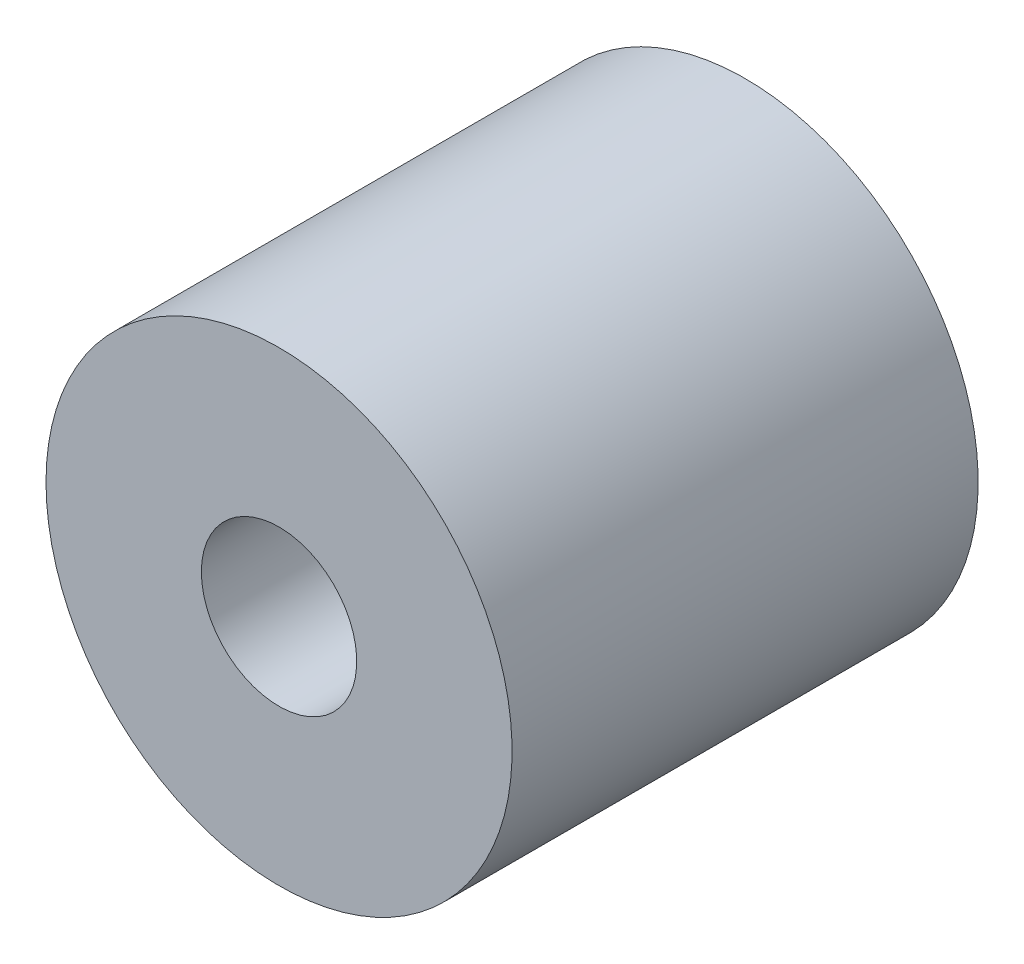
ISO-10303-21;
HEADER;
FILE_DESCRIPTION(('STEP AP214'),'2;1');
FILE_NAME('part.step','',(''),(''),'','','');
FILE_SCHEMA(('AUTOMOTIVE_DESIGN { 1 0 10303 214 1 1 1 1 }'));
ENDSEC;
DATA;
#1=APPLICATION_CONTEXT('core data for automotive mechanical design processes');
#2=APPLICATION_PROTOCOL_DEFINITION('international standard','automotive_design',2000,#1);
#3=PRODUCT_CONTEXT('',#1,'mechanical');
#4=PRODUCT('Part','Part','',(#3));
#5=PRODUCT_RELATED_PRODUCT_CATEGORY('part','',(#4));
#6=PRODUCT_DEFINITION_FORMATION('','',#4);
#7=PRODUCT_DEFINITION_CONTEXT('part definition',#1,'design');
#8=PRODUCT_DEFINITION('design','',#6,#7);
#9=PRODUCT_DEFINITION_SHAPE('','',#8);
#10=(LENGTH_UNIT() NAMED_UNIT(*) SI_UNIT(.MILLI.,.METRE.));
#11=(NAMED_UNIT(*) PLANE_ANGLE_UNIT() SI_UNIT($,.RADIAN.));
#12=(NAMED_UNIT(*) SI_UNIT($,.STERADIAN.) SOLID_ANGLE_UNIT());
#13=UNCERTAINTY_MEASURE_WITH_UNIT(LENGTH_MEASURE(1.E-05),#10,'distance_accuracy_value','');
#14=(GEOMETRIC_REPRESENTATION_CONTEXT(3) GLOBAL_UNCERTAINTY_ASSIGNED_CONTEXT((#13)) GLOBAL_UNIT_ASSIGNED_CONTEXT((#10,
#11,#12)) REPRESENTATION_CONTEXT('',''));
#15=CARTESIAN_POINT('',(0.,0.,0.));
#16=DIRECTION('',(0.,0.,1.));
#17=DIRECTION('',(1.,0.,0.));
#18=AXIS2_PLACEMENT_3D('',#15,#16,#17);
#19=CARTESIAN_POINT('',(0.,0.,0.));
#20=DIRECTION('',(0.,0.,-1.));
#21=DIRECTION('',(-1.,0.,0.));
#22=AXIS2_PLACEMENT_3D('',#19,#20,#21);
#23=CYLINDRICAL_SURFACE('',#22,2.);
#24=CARTESIAN_POINT('',(0.,0.,12.));
#25=DIRECTION('',(0.,0.,-1.));
#26=DIRECTION('',(-1.,0.,0.));
#27=AXIS2_PLACEMENT_3D('',#24,#25,#26);
#28=CIRCLE('',#27,2.);
#29=CARTESIAN_POINT('',(-2.,0.,12.));
#30=VERTEX_POINT('',#29);
#31=EDGE_CURVE('E10',#30,#30,#28,.T.);
#32=ORIENTED_EDGE('',*,*,#31,.F.);
#33=EDGE_LOOP('',(#32));
#34=FACE_BOUND('',#33,.T.);
#35=CARTESIAN_POINT('',(0.,0.,0.));
#36=DIRECTION('',(0.,0.,-1.));
#37=DIRECTION('',(-1.,0.,0.));
#38=AXIS2_PLACEMENT_3D('',#35,#36,#37);
#39=CIRCLE('',#38,2.);
#40=CARTESIAN_POINT('',(-2.,0.,0.));
#41=VERTEX_POINT('',#40);
#42=EDGE_CURVE('E54',#41,#41,#39,.T.);
#43=ORIENTED_EDGE('',*,*,#42,.T.);
#44=EDGE_LOOP('',(#43));
#45=FACE_BOUND('',#44,.T.);
#46=ADVANCED_FACE('F41',(#34,#45),#23,.F.);
#47=CARTESIAN_POINT('',(2.,0.,12.));
#48=DIRECTION('',(0.,0.,-1.));
#49=DIRECTION('',(-1.,0.,0.));
#50=AXIS2_PLACEMENT_3D('',#47,#48,#49);
#51=PLANE('',#50);
#52=CARTESIAN_POINT('',(0.,0.,12.));
#53=DIRECTION('',(0.,0.,-1.));
#54=DIRECTION('',(-1.,0.,0.));
#55=AXIS2_PLACEMENT_3D('',#52,#53,#54);
#56=CIRCLE('',#55,6.);
#57=CARTESIAN_POINT('',(-6.,0.,12.));
#58=VERTEX_POINT('',#57);
#59=EDGE_CURVE('E50',#58,#58,#56,.T.);
#60=ORIENTED_EDGE('',*,*,#59,.F.);
#61=EDGE_LOOP('',(#60));
#62=FACE_BOUND('',#61,.T.);
#63=ORIENTED_EDGE('',*,*,#31,.T.);
#64=EDGE_LOOP('',(#63));
#65=FACE_BOUND('',#64,.T.);
#66=ADVANCED_FACE('F68',(#62,#65),#51,.F.);
#67=CARTESIAN_POINT('',(0.,0.,0.));
#68=DIRECTION('',(0.,0.,-1.));
#69=DIRECTION('',(-1.,0.,0.));
#70=AXIS2_PLACEMENT_3D('',#67,#68,#69);
#71=CYLINDRICAL_SURFACE('',#70,6.);
#72=CARTESIAN_POINT('',(0.,0.,0.));
#73=DIRECTION('',(0.,0.,-1.));
#74=DIRECTION('',(-1.,0.,0.));
#75=AXIS2_PLACEMENT_3D('',#72,#73,#74);
#76=CIRCLE('',#75,6.);
#77=CARTESIAN_POINT('',(-6.,0.,0.));
#78=VERTEX_POINT('',#77);
#79=EDGE_CURVE('E51',#78,#78,#76,.T.);
#80=ORIENTED_EDGE('',*,*,#79,.F.);
#81=EDGE_LOOP('',(#80));
#82=FACE_BOUND('',#81,.T.);
#83=ORIENTED_EDGE('',*,*,#59,.T.);
#84=EDGE_LOOP('',(#83));
#85=FACE_BOUND('',#84,.T.);
#86=ADVANCED_FACE('F62',(#82,#85),#71,.T.);
#87=CARTESIAN_POINT('',(2.,0.,0.));
#88=DIRECTION('',(0.,0.,1.));
#89=DIRECTION('',(1.,0.,0.));
#90=AXIS2_PLACEMENT_3D('',#87,#88,#89);
#91=PLANE('',#90);
#92=ORIENTED_EDGE('',*,*,#42,.F.);
#93=EDGE_LOOP('',(#92));
#94=FACE_BOUND('',#93,.T.);
#95=ORIENTED_EDGE('',*,*,#79,.T.);
#96=EDGE_LOOP('',(#95));
#97=FACE_BOUND('',#96,.T.);
#98=ADVANCED_FACE('F61',(#94,#97),#91,.F.);
#99=CLOSED_SHELL('',(#46,#66,#86,#98));
#100=MANIFOLD_SOLID_BREP('B2',#99);
#101=ADVANCED_BREP_SHAPE_REPRESENTATION('',(#18,#100),#14);
#102=SHAPE_DEFINITION_REPRESENTATION(#9,#101);
ENDSEC;
END-ISO-10303-21;
